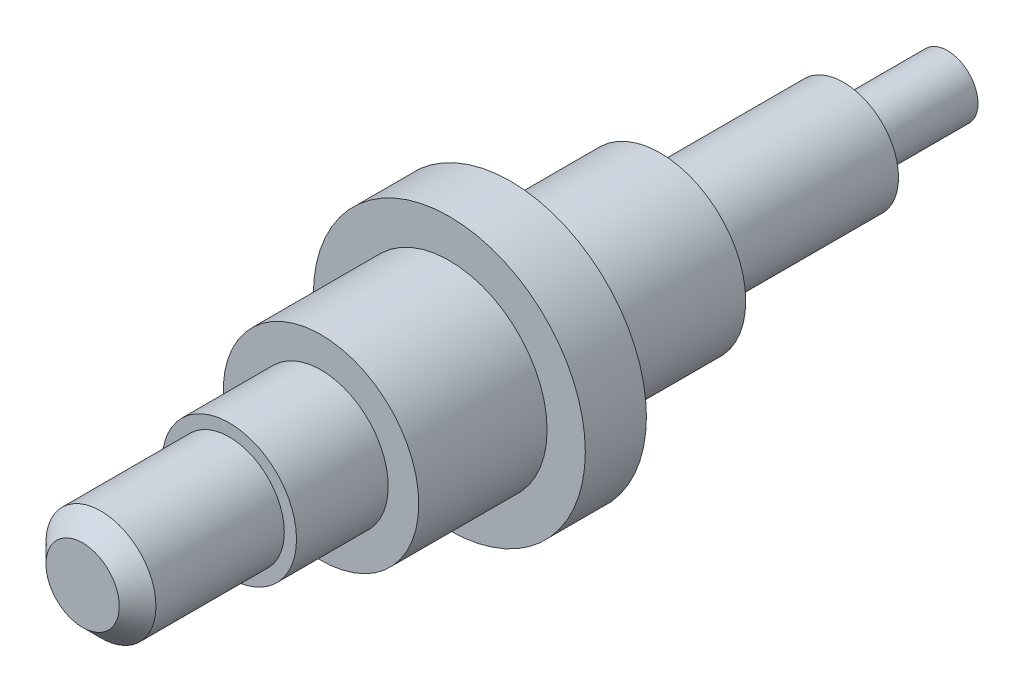
ISO-10303-21;
HEADER;
FILE_DESCRIPTION(('STEP AP214'),'2;1');
FILE_NAME('part.step','',(''),(''),'','','');
FILE_SCHEMA(('AUTOMOTIVE_DESIGN { 1 0 10303 214 1 1 1 1 }'));
ENDSEC;
DATA;
#1=APPLICATION_CONTEXT('core data for automotive mechanical design processes');
#2=APPLICATION_PROTOCOL_DEFINITION('international standard','automotive_design',2000,#1);
#3=PRODUCT_CONTEXT('',#1,'mechanical');
#4=PRODUCT('Part','Part','',(#3));
#5=PRODUCT_RELATED_PRODUCT_CATEGORY('part','',(#4));
#6=PRODUCT_DEFINITION_FORMATION('','',#4);
#7=PRODUCT_DEFINITION_CONTEXT('part definition',#1,'design');
#8=PRODUCT_DEFINITION('design','',#6,#7);
#9=PRODUCT_DEFINITION_SHAPE('','',#8);
#10=(LENGTH_UNIT() NAMED_UNIT(*) SI_UNIT(.MILLI.,.METRE.));
#11=(NAMED_UNIT(*) PLANE_ANGLE_UNIT() SI_UNIT($,.RADIAN.));
#12=(NAMED_UNIT(*) SI_UNIT($,.STERADIAN.) SOLID_ANGLE_UNIT());
#13=UNCERTAINTY_MEASURE_WITH_UNIT(LENGTH_MEASURE(1.E-05),#10,'distance_accuracy_value','');
#14=(GEOMETRIC_REPRESENTATION_CONTEXT(3) GLOBAL_UNCERTAINTY_ASSIGNED_CONTEXT((#13)) GLOBAL_UNIT_ASSIGNED_CONTEXT((#10,
#11,#12)) REPRESENTATION_CONTEXT('',''));
#15=CARTESIAN_POINT('',(0.,0.,0.));
#16=DIRECTION('',(0.,0.,1.));
#17=DIRECTION('',(1.,0.,0.));
#18=AXIS2_PLACEMENT_3D('',#15,#16,#17);
#19=CARTESIAN_POINT('',(0.,0.,-141.5));
#20=DIRECTION('',(0.,0.,1.));
#21=DIRECTION('',(1.,0.,0.));
#22=AXIS2_PLACEMENT_3D('',#19,#20,#21);
#23=PLANE('',#22);
#24=CARTESIAN_POINT('',(0.,0.,-141.5));
#25=DIRECTION('',(0.,0.,1.));
#26=DIRECTION('',(1.,0.,0.));
#27=AXIS2_PLACEMENT_3D('',#24,#25,#26);
#28=CIRCLE('',#27,5.);
#29=CARTESIAN_POINT('',(5.,0.,-141.5));
#30=VERTEX_POINT('',#29);
#31=EDGE_CURVE('E45',#30,#30,#28,.T.);
#32=ORIENTED_EDGE('',*,*,#31,.F.);
#33=EDGE_LOOP('',(#32));
#34=FACE_BOUND('',#33,.T.);
#35=ADVANCED_FACE('F34',(#34),#23,.F.);
#36=CARTESIAN_POINT('',(0.,0.,-60.));
#37=DIRECTION('',(0.,0.,1.));
#38=DIRECTION('',(1.,0.,0.));
#39=AXIS2_PLACEMENT_3D('',#36,#37,#38);
#40=CYLINDRICAL_SURFACE('',#39,5.);
#41=ORIENTED_EDGE('',*,*,#31,.T.);
#42=EDGE_LOOP('',(#41));
#43=FACE_BOUND('',#42,.T.);
#44=CARTESIAN_POINT('',(0.,0.,-124.5));
#45=DIRECTION('',(0.,0.,1.));
#46=DIRECTION('',(1.,0.,0.));
#47=AXIS2_PLACEMENT_3D('',#44,#45,#46);
#48=CIRCLE('',#47,5.);
#49=CARTESIAN_POINT('',(5.,0.,-124.5));
#50=VERTEX_POINT('',#49);
#51=EDGE_CURVE('E49',#50,#50,#48,.T.);
#52=ORIENTED_EDGE('',*,*,#51,.F.);
#53=EDGE_LOOP('',(#52));
#54=FACE_BOUND('',#53,.T.);
#55=ADVANCED_FACE('F105',(#43,#54),#40,.T.);
#56=CARTESIAN_POINT('',(0.,0.,-124.5));
#57=DIRECTION('',(0.,0.,1.));
#58=DIRECTION('',(1.,0.,0.));
#59=AXIS2_PLACEMENT_3D('',#56,#57,#58);
#60=PLANE('',#59);
#61=CARTESIAN_POINT('',(0.,0.,-124.5));
#62=DIRECTION('',(0.,0.,1.));
#63=DIRECTION('',(1.,0.,0.));
#64=AXIS2_PLACEMENT_3D('',#61,#62,#63);
#65=CIRCLE('',#64,9.);
#66=CARTESIAN_POINT('',(9.,0.,-124.5));
#67=VERTEX_POINT('',#66);
#68=EDGE_CURVE('E54',#67,#67,#65,.T.);
#69=ORIENTED_EDGE('',*,*,#68,.F.);
#70=EDGE_LOOP('',(#69));
#71=FACE_BOUND('',#70,.T.);
#72=ORIENTED_EDGE('',*,*,#51,.T.);
#73=EDGE_LOOP('',(#72));
#74=FACE_BOUND('',#73,.T.);
#75=ADVANCED_FACE('F110',(#71,#74),#60,.F.);
#76=CARTESIAN_POINT('',(0.,0.,-60.));
#77=DIRECTION('',(0.,0.,1.));
#78=DIRECTION('',(1.,0.,0.));
#79=AXIS2_PLACEMENT_3D('',#76,#77,#78);
#80=CYLINDRICAL_SURFACE('',#79,9.);
#81=ORIENTED_EDGE('',*,*,#68,.T.);
#82=EDGE_LOOP('',(#81));
#83=FACE_BOUND('',#82,.T.);
#84=CARTESIAN_POINT('',(0.,0.,-94.5));
#85=DIRECTION('',(0.,0.,1.));
#86=DIRECTION('',(1.,0.,0.));
#87=AXIS2_PLACEMENT_3D('',#84,#85,#86);
#88=CIRCLE('',#87,9.);
#89=CARTESIAN_POINT('',(9.,0.,-94.5));
#90=VERTEX_POINT('',#89);
#91=EDGE_CURVE('E57',#90,#90,#88,.T.);
#92=ORIENTED_EDGE('',*,*,#91,.F.);
#93=EDGE_LOOP('',(#92));
#94=FACE_BOUND('',#93,.T.);
#95=ADVANCED_FACE('F117',(#83,#94),#80,.T.);
#96=CARTESIAN_POINT('',(0.,0.,-94.5));
#97=DIRECTION('',(0.,0.,1.));
#98=DIRECTION('',(1.,0.,0.));
#99=AXIS2_PLACEMENT_3D('',#96,#97,#98);
#100=PLANE('',#99);
#101=CARTESIAN_POINT('',(0.,0.,-94.5));
#102=DIRECTION('',(0.,0.,1.));
#103=DIRECTION('',(1.,0.,0.));
#104=AXIS2_PLACEMENT_3D('',#101,#102,#103);
#105=CIRCLE('',#104,14.);
#106=CARTESIAN_POINT('',(14.,0.,-94.5));
#107=VERTEX_POINT('',#106);
#108=EDGE_CURVE('E60',#107,#107,#105,.T.);
#109=ORIENTED_EDGE('',*,*,#108,.F.);
#110=EDGE_LOOP('',(#109));
#111=FACE_BOUND('',#110,.T.);
#112=ORIENTED_EDGE('',*,*,#91,.T.);
#113=EDGE_LOOP('',(#112));
#114=FACE_BOUND('',#113,.T.);
#115=ADVANCED_FACE('F121',(#111,#114),#100,.F.);
#116=CARTESIAN_POINT('',(0.,0.,-60.));
#117=DIRECTION('',(0.,0.,1.));
#118=DIRECTION('',(1.,0.,0.));
#119=AXIS2_PLACEMENT_3D('',#116,#117,#118);
#120=CYLINDRICAL_SURFACE('',#119,14.);
#121=ORIENTED_EDGE('',*,*,#108,.T.);
#122=EDGE_LOOP('',(#121));
#123=FACE_BOUND('',#122,.T.);
#124=CARTESIAN_POINT('',(0.,0.,-70.));
#125=DIRECTION('',(0.,0.,1.));
#126=DIRECTION('',(1.,0.,0.));
#127=AXIS2_PLACEMENT_3D('',#124,#125,#126);
#128=CIRCLE('',#127,14.);
#129=CARTESIAN_POINT('',(14.,0.,-70.));
#130=VERTEX_POINT('',#129);
#131=EDGE_CURVE('E63',#130,#130,#128,.T.);
#132=ORIENTED_EDGE('',*,*,#131,.F.);
#133=EDGE_LOOP('',(#132));
#134=FACE_BOUND('',#133,.T.);
#135=ADVANCED_FACE('F125',(#123,#134),#120,.T.);
#136=CARTESIAN_POINT('',(0.,0.,-70.));
#137=DIRECTION('',(0.,0.,1.));
#138=DIRECTION('',(1.,0.,0.));
#139=AXIS2_PLACEMENT_3D('',#136,#137,#138);
#140=PLANE('',#139);
#141=CARTESIAN_POINT('',(0.,0.,-70.));
#142=DIRECTION('',(0.,0.,1.));
#143=DIRECTION('',(1.,0.,0.));
#144=AXIS2_PLACEMENT_3D('',#141,#142,#143);
#145=CIRCLE('',#144,22.25);
#146=CARTESIAN_POINT('',(22.25,0.,-70.));
#147=VERTEX_POINT('',#146);
#148=EDGE_CURVE('E66',#147,#147,#145,.T.);
#149=ORIENTED_EDGE('',*,*,#148,.F.);
#150=EDGE_LOOP('',(#149));
#151=FACE_BOUND('',#150,.T.);
#152=ORIENTED_EDGE('',*,*,#131,.T.);
#153=EDGE_LOOP('',(#152));
#154=FACE_BOUND('',#153,.T.);
#155=ADVANCED_FACE('F129',(#151,#154),#140,.F.);
#156=CARTESIAN_POINT('',(0.,0.,-60.));
#157=DIRECTION('',(0.,0.,1.));
#158=DIRECTION('',(1.,0.,0.));
#159=AXIS2_PLACEMENT_3D('',#156,#157,#158);
#160=CYLINDRICAL_SURFACE('',#159,22.25);
#161=ORIENTED_EDGE('',*,*,#148,.T.);
#162=EDGE_LOOP('',(#161));
#163=FACE_BOUND('',#162,.T.);
#164=CARTESIAN_POINT('',(0.,0.,-60.));
#165=DIRECTION('',(0.,0.,1.));
#166=DIRECTION('',(1.,0.,0.));
#167=AXIS2_PLACEMENT_3D('',#164,#165,#166);
#168=CIRCLE('',#167,22.25);
#169=CARTESIAN_POINT('',(22.25,0.,-60.));
#170=VERTEX_POINT('',#169);
#171=EDGE_CURVE('E69',#170,#170,#168,.T.);
#172=ORIENTED_EDGE('',*,*,#171,.F.);
#173=EDGE_LOOP('',(#172));
#174=FACE_BOUND('',#173,.T.);
#175=ADVANCED_FACE('F133',(#163,#174),#160,.T.);
#176=CARTESIAN_POINT('',(0.,0.,-60.));
#177=DIRECTION('',(0.,0.,1.));
#178=DIRECTION('',(1.,0.,0.));
#179=AXIS2_PLACEMENT_3D('',#176,#177,#178);
#180=PLANE('',#179);
#181=ORIENTED_EDGE('',*,*,#171,.T.);
#182=EDGE_LOOP('',(#181));
#183=FACE_BOUND('',#182,.T.);
#184=CARTESIAN_POINT('',(0.,0.,-60.));
#185=DIRECTION('',(0.,0.,1.));
#186=DIRECTION('',(1.,0.,0.));
#187=AXIS2_PLACEMENT_3D('',#184,#185,#186);
#188=CIRCLE('',#187,16.);
#189=CARTESIAN_POINT('',(16.,0.,-60.));
#190=VERTEX_POINT('',#189);
#191=EDGE_CURVE('E72',#190,#190,#188,.T.);
#192=ORIENTED_EDGE('',*,*,#191,.F.);
#193=EDGE_LOOP('',(#192));
#194=FACE_BOUND('',#193,.T.);
#195=ADVANCED_FACE('F137',(#183,#194),#180,.T.);
#196=CARTESIAN_POINT('',(0.,0.,-60.));
#197=DIRECTION('',(0.,0.,1.));
#198=DIRECTION('',(1.,0.,0.));
#199=AXIS2_PLACEMENT_3D('',#196,#197,#198);
#200=CYLINDRICAL_SURFACE('',#199,16.);
#201=ORIENTED_EDGE('',*,*,#191,.T.);
#202=EDGE_LOOP('',(#201));
#203=FACE_BOUND('',#202,.T.);
#204=CARTESIAN_POINT('',(0.,0.,-39.));
#205=DIRECTION('',(0.,0.,1.));
#206=DIRECTION('',(1.,0.,0.));
#207=AXIS2_PLACEMENT_3D('',#204,#205,#206);
#208=CIRCLE('',#207,16.);
#209=CARTESIAN_POINT('',(16.,0.,-39.));
#210=VERTEX_POINT('',#209);
#211=EDGE_CURVE('E75',#210,#210,#208,.T.);
#212=ORIENTED_EDGE('',*,*,#211,.F.);
#213=EDGE_LOOP('',(#212));
#214=FACE_BOUND('',#213,.T.);
#215=ADVANCED_FACE('F141',(#203,#214),#200,.T.);
#216=CARTESIAN_POINT('',(0.,0.,-39.));
#217=DIRECTION('',(0.,0.,1.));
#218=DIRECTION('',(1.,0.,0.));
#219=AXIS2_PLACEMENT_3D('',#216,#217,#218);
#220=PLANE('',#219);
#221=ORIENTED_EDGE('',*,*,#211,.T.);
#222=EDGE_LOOP('',(#221));
#223=FACE_BOUND('',#222,.T.);
#224=CARTESIAN_POINT('',(0.,0.,-39.));
#225=DIRECTION('',(0.,0.,1.));
#226=DIRECTION('',(1.,0.,0.));
#227=AXIS2_PLACEMENT_3D('',#224,#225,#226);
#228=CIRCLE('',#227,11.);
#229=CARTESIAN_POINT('',(11.,0.,-39.));
#230=VERTEX_POINT('',#229);
#231=EDGE_CURVE('E78',#230,#230,#228,.T.);
#232=ORIENTED_EDGE('',*,*,#231,.F.);
#233=EDGE_LOOP('',(#232));
#234=FACE_BOUND('',#233,.T.);
#235=ADVANCED_FACE('F101',(#223,#234),#220,.T.);
#236=CARTESIAN_POINT('',(0.,0.,-60.));
#237=DIRECTION('',(0.,0.,1.));
#238=DIRECTION('',(1.,0.,0.));
#239=AXIS2_PLACEMENT_3D('',#236,#237,#238);
#240=CYLINDRICAL_SURFACE('',#239,11.);
#241=ORIENTED_EDGE('',*,*,#231,.T.);
#242=EDGE_LOOP('',(#241));
#243=FACE_BOUND('',#242,.T.);
#244=CARTESIAN_POINT('',(0.,0.,-24.));
#245=DIRECTION('',(0.,0.,1.));
#246=DIRECTION('',(1.,0.,0.));
#247=AXIS2_PLACEMENT_3D('',#244,#245,#246);
#248=CIRCLE('',#247,11.);
#249=CARTESIAN_POINT('',(11.,0.,-24.));
#250=VERTEX_POINT('',#249);
#251=EDGE_CURVE('E81',#250,#250,#248,.T.);
#252=ORIENTED_EDGE('',*,*,#251,.F.);
#253=EDGE_LOOP('',(#252));
#254=FACE_BOUND('',#253,.T.);
#255=ADVANCED_FACE('F92',(#243,#254),#240,.T.);
#256=CARTESIAN_POINT('',(0.,0.,-24.));
#257=DIRECTION('',(0.,0.,1.));
#258=DIRECTION('',(1.,0.,0.));
#259=AXIS2_PLACEMENT_3D('',#256,#257,#258);
#260=PLANE('',#259);
#261=ORIENTED_EDGE('',*,*,#251,.T.);
#262=EDGE_LOOP('',(#261));
#263=FACE_BOUND('',#262,.T.);
#264=CARTESIAN_POINT('',(0.,0.,-24.));
#265=DIRECTION('',(0.,0.,1.));
#266=DIRECTION('',(1.,0.,0.));
#267=AXIS2_PLACEMENT_3D('',#264,#265,#266);
#268=CIRCLE('',#267,9.);
#269=CARTESIAN_POINT('',(9.,0.,-24.));
#270=VERTEX_POINT('',#269);
#271=EDGE_CURVE('E84',#270,#270,#268,.T.);
#272=ORIENTED_EDGE('',*,*,#271,.F.);
#273=EDGE_LOOP('',(#272));
#274=FACE_BOUND('',#273,.T.);
#275=ADVANCED_FACE('F90',(#263,#274),#260,.T.);
#276=CARTESIAN_POINT('',(0.,0.,-60.));
#277=DIRECTION('',(0.,0.,1.));
#278=DIRECTION('',(1.,0.,0.));
#279=AXIS2_PLACEMENT_3D('',#276,#277,#278);
#280=CYLINDRICAL_SURFACE('',#279,9.);
#281=CARTESIAN_POINT('',(0.,0.,-3.00000000000001));
#282=DIRECTION('',(0.,0.,1.));
#283=DIRECTION('',(1.,0.,0.));
#284=AXIS2_PLACEMENT_3D('',#281,#282,#283);
#285=CIRCLE('',#284,9.);
#286=CARTESIAN_POINT('',(9.,0.,-3.00000000000001));
#287=VERTEX_POINT('',#286);
#288=EDGE_CURVE('E10',#287,#287,#285,.F.);
#289=ORIENTED_EDGE('',*,*,#288,.T.);
#290=EDGE_LOOP('',(#289));
#291=FACE_BOUND('',#290,.T.);
#292=ORIENTED_EDGE('',*,*,#271,.T.);
#293=EDGE_LOOP('',(#292));
#294=FACE_BOUND('',#293,.T.);
#295=ADVANCED_FACE('F88',(#291,#294),#280,.T.);
#296=CARTESIAN_POINT('',(0.,0.,0.));
#297=DIRECTION('',(0.,0.,1.));
#298=DIRECTION('',(1.,0.,0.));
#299=AXIS2_PLACEMENT_3D('',#296,#297,#298);
#300=PLANE('',#299);
#301=CARTESIAN_POINT('',(0.,0.,0.));
#302=DIRECTION('',(0.,0.,1.));
#303=DIRECTION('',(1.,0.,0.));
#304=AXIS2_PLACEMENT_3D('',#301,#302,#303);
#305=CIRCLE('',#304,6.00000000000001);
#306=CARTESIAN_POINT('',(6.00000000000001,0.,0.));
#307=VERTEX_POINT('',#306);
#308=EDGE_CURVE('E41',#307,#307,#305,.T.);
#309=ORIENTED_EDGE('',*,*,#308,.T.);
#310=EDGE_LOOP('',(#309));
#311=FACE_BOUND('',#310,.T.);
#312=ADVANCED_FACE('F99',(#311),#300,.T.);
#313=CARTESIAN_POINT('',(0.,0.,0.));
#314=DIRECTION('',(0.,0.,-1.));
#315=DIRECTION('',(-1.,0.,0.));
#316=AXIS2_PLACEMENT_3D('',#313,#314,#315);
#317=CONICAL_SURFACE('',#316,6.00000000000001,0.785398163397446);
#318=ORIENTED_EDGE('',*,*,#288,.F.);
#319=EDGE_LOOP('',(#318));
#320=FACE_BOUND('',#319,.T.);
#321=ORIENTED_EDGE('',*,*,#308,.F.);
#322=EDGE_LOOP('',(#321));
#323=FACE_BOUND('',#322,.T.);
#324=ADVANCED_FACE('F36',(#320,#323),#317,.T.);
#325=CLOSED_SHELL('',(#35,#55,#75,#95,#115,#135,#155,#175,#195,#215,#235,#255,#275,#295,#312,#324));
#326=MANIFOLD_SOLID_BREP('B2',#325);
#327=ADVANCED_BREP_SHAPE_REPRESENTATION('',(#18,#326),#14);
#328=SHAPE_DEFINITION_REPRESENTATION(#9,#327);
ENDSEC;
END-ISO-10303-21;
